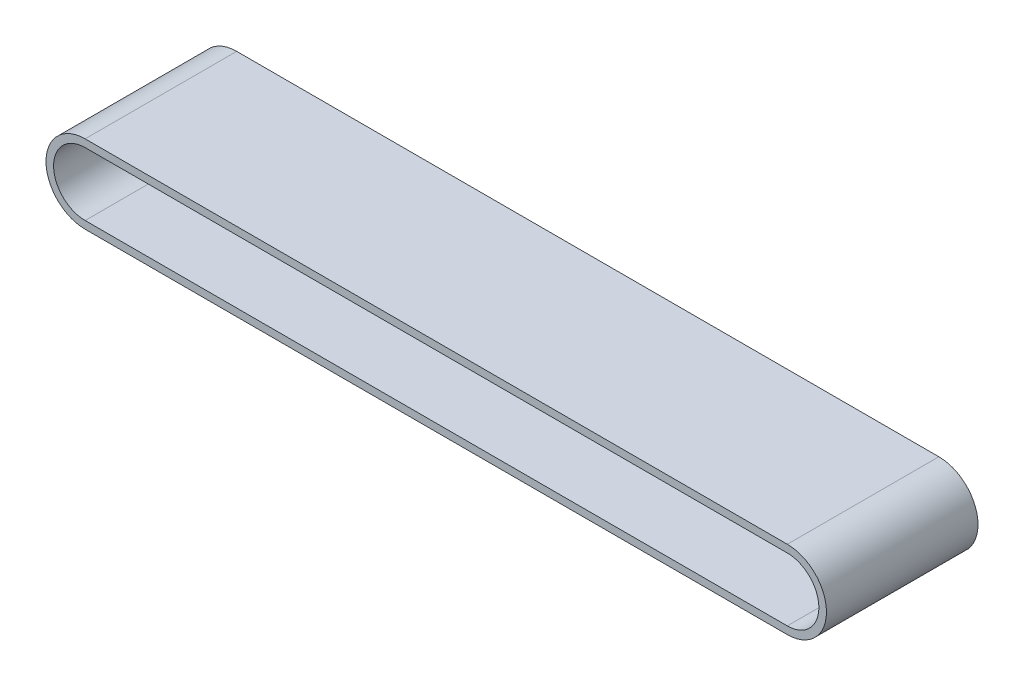
ISO-10303-21;
HEADER;
FILE_DESCRIPTION(('STEP AP214'),'2;1');
FILE_NAME('part.step','',(''),(''),'','','');
FILE_SCHEMA(('AUTOMOTIVE_DESIGN { 1 0 10303 214 1 1 1 1 }'));
ENDSEC;
DATA;
#1=APPLICATION_CONTEXT('core data for automotive mechanical design processes');
#2=APPLICATION_PROTOCOL_DEFINITION('international standard','automotive_design',2000,#1);
#3=PRODUCT_CONTEXT('',#1,'mechanical');
#4=PRODUCT('Part','Part','',(#3));
#5=PRODUCT_RELATED_PRODUCT_CATEGORY('part','',(#4));
#6=PRODUCT_DEFINITION_FORMATION('','',#4);
#7=PRODUCT_DEFINITION_CONTEXT('part definition',#1,'design');
#8=PRODUCT_DEFINITION('design','',#6,#7);
#9=PRODUCT_DEFINITION_SHAPE('','',#8);
#10=(LENGTH_UNIT() NAMED_UNIT(*) SI_UNIT(.MILLI.,.METRE.));
#11=(NAMED_UNIT(*) PLANE_ANGLE_UNIT() SI_UNIT($,.RADIAN.));
#12=(NAMED_UNIT(*) SI_UNIT($,.STERADIAN.) SOLID_ANGLE_UNIT());
#13=UNCERTAINTY_MEASURE_WITH_UNIT(LENGTH_MEASURE(1.E-05),#10,'distance_accuracy_value','');
#14=(GEOMETRIC_REPRESENTATION_CONTEXT(3) GLOBAL_UNCERTAINTY_ASSIGNED_CONTEXT((#13)) GLOBAL_UNIT_ASSIGNED_CONTEXT((#10,
#11,#12)) REPRESENTATION_CONTEXT('',''));
#15=CARTESIAN_POINT('',(0.,0.,0.));
#16=DIRECTION('',(0.,0.,1.));
#17=DIRECTION('',(1.,0.,0.));
#18=AXIS2_PLACEMENT_3D('',#15,#16,#17);
#19=CARTESIAN_POINT('',(-29.7120418848168,12.5,60.));
#20=DIRECTION('',(0.,0.,1.));
#21=DIRECTION('',(1.,0.,0.));
#22=AXIS2_PLACEMENT_3D('',#19,#20,#21);
#23=PLANE('',#22);
#24=CARTESIAN_POINT('',(-29.7120418848168,12.5,60.));
#25=DIRECTION('',(0.,0.,1.));
#26=DIRECTION('',(1.,0.,0.));
#27=AXIS2_PLACEMENT_3D('',#24,#25,#26);
#28=CIRCLE('',#27,15.5);
#29=CARTESIAN_POINT('',(-29.7120418848168,28.,60.));
#30=VERTEX_POINT('',#29);
#31=CARTESIAN_POINT('',(-29.7120418848168,-2.99999999999998,60.));
#32=VERTEX_POINT('',#31);
#33=EDGE_CURVE('E140',#30,#32,#28,.T.);
#34=ORIENTED_EDGE('',*,*,#33,.T.);
#35=DIRECTION('',(1.,0.,0.));
#36=VECTOR('',#35,1.);
#37=CARTESIAN_POINT('',(-29.7120418848168,-2.99999999999998,60.));
#38=LINE('',#37,#36);
#39=CARTESIAN_POINT('',(248.287958115183,-3.,60.));
#40=VERTEX_POINT('',#39);
#41=EDGE_CURVE('E143',#32,#40,#38,.T.);
#42=ORIENTED_EDGE('',*,*,#41,.T.);
#43=CARTESIAN_POINT('',(248.287958115183,12.5,60.));
#44=DIRECTION('',(0.,0.,1.));
#45=DIRECTION('',(1.,0.,0.));
#46=AXIS2_PLACEMENT_3D('',#43,#44,#45);
#47=CIRCLE('',#46,15.5);
#48=CARTESIAN_POINT('',(248.287958115183,28.,60.));
#49=VERTEX_POINT('',#48);
#50=EDGE_CURVE('E146',#40,#49,#47,.T.);
#51=ORIENTED_EDGE('',*,*,#50,.T.);
#52=DIRECTION('',(-1.,0.,0.));
#53=VECTOR('',#52,1.);
#54=CARTESIAN_POINT('',(-29.7120418848168,28.,60.));
#55=LINE('',#54,#53);
#56=EDGE_CURVE('E148',#49,#30,#55,.T.);
#57=ORIENTED_EDGE('',*,*,#56,.T.);
#58=EDGE_LOOP('',(#34,#42,#51,#57));
#59=FACE_BOUND('',#58,.T.);
#60=DIRECTION('',(1.,0.,0.));
#61=VECTOR('',#60,1.);
#62=CARTESIAN_POINT('',(-29.7120418848168,0.,60.));
#63=LINE('',#62,#61);
#64=CARTESIAN_POINT('',(-29.7120418848168,0.,60.));
#65=VERTEX_POINT('',#64);
#66=CARTESIAN_POINT('',(248.287958115183,0.,60.));
#67=VERTEX_POINT('',#66);
#68=EDGE_CURVE('E112',#65,#67,#63,.T.);
#69=ORIENTED_EDGE('',*,*,#68,.F.);
#70=CARTESIAN_POINT('',(-29.7120418848168,12.5,60.));
#71=DIRECTION('',(0.,0.,1.));
#72=DIRECTION('',(1.,0.,0.));
#73=AXIS2_PLACEMENT_3D('',#70,#71,#72);
#74=CIRCLE('',#73,12.5);
#75=CARTESIAN_POINT('',(-29.7120418848168,25.,60.));
#76=VERTEX_POINT('',#75);
#77=EDGE_CURVE('E104',#76,#65,#74,.T.);
#78=ORIENTED_EDGE('',*,*,#77,.F.);
#79=DIRECTION('',(-1.,0.,0.));
#80=VECTOR('',#79,1.);
#81=CARTESIAN_POINT('',(-29.7120418848168,25.,60.));
#82=LINE('',#81,#80);
#83=CARTESIAN_POINT('',(248.287958115183,25.,60.));
#84=VERTEX_POINT('',#83);
#85=EDGE_CURVE('E126',#84,#76,#82,.T.);
#86=ORIENTED_EDGE('',*,*,#85,.F.);
#87=CARTESIAN_POINT('',(248.287958115183,12.5,60.));
#88=DIRECTION('',(0.,0.,1.));
#89=DIRECTION('',(1.,0.,0.));
#90=AXIS2_PLACEMENT_3D('',#87,#88,#89);
#91=CIRCLE('',#90,12.5);
#92=EDGE_CURVE('E124',#67,#84,#91,.T.);
#93=ORIENTED_EDGE('',*,*,#92,.F.);
#94=EDGE_LOOP('',(#69,#78,#86,#93));
#95=FACE_BOUND('',#94,.T.);
#96=ADVANCED_FACE('F39',(#59,#95),#23,.T.);
#97=CARTESIAN_POINT('',(-29.7120418848168,12.5,0.));
#98=DIRECTION('',(0.,0.,1.));
#99=DIRECTION('',(1.,0.,0.));
#100=AXIS2_PLACEMENT_3D('',#97,#98,#99);
#101=PLANE('',#100);
#102=CARTESIAN_POINT('',(-29.7120418848168,12.5,0.));
#103=DIRECTION('',(0.,0.,1.));
#104=DIRECTION('',(1.,0.,0.));
#105=AXIS2_PLACEMENT_3D('',#102,#103,#104);
#106=CIRCLE('',#105,15.5);
#107=CARTESIAN_POINT('',(-29.7120418848168,28.,0.));
#108=VERTEX_POINT('',#107);
#109=CARTESIAN_POINT('',(-29.7120418848168,-2.99999999999998,0.));
#110=VERTEX_POINT('',#109);
#111=EDGE_CURVE('E120',#108,#110,#106,.T.);
#112=ORIENTED_EDGE('',*,*,#111,.F.);
#113=DIRECTION('',(-1.,0.,0.));
#114=VECTOR('',#113,1.);
#115=CARTESIAN_POINT('',(-29.7120418848168,28.,0.));
#116=LINE('',#115,#114);
#117=CARTESIAN_POINT('',(248.287958115183,28.,0.));
#118=VERTEX_POINT('',#117);
#119=EDGE_CURVE('E144',#118,#108,#116,.T.);
#120=ORIENTED_EDGE('',*,*,#119,.F.);
#121=CARTESIAN_POINT('',(248.287958115183,12.5,0.));
#122=DIRECTION('',(0.,0.,1.));
#123=DIRECTION('',(1.,0.,0.));
#124=AXIS2_PLACEMENT_3D('',#121,#122,#123);
#125=CIRCLE('',#124,15.5);
#126=CARTESIAN_POINT('',(248.287958115183,-3.,0.));
#127=VERTEX_POINT('',#126);
#128=EDGE_CURVE('E155',#127,#118,#125,.T.);
#129=ORIENTED_EDGE('',*,*,#128,.F.);
#130=DIRECTION('',(1.,0.,0.));
#131=VECTOR('',#130,1.);
#132=CARTESIAN_POINT('',(-29.7120418848168,-2.99999999999998,0.));
#133=LINE('',#132,#131);
#134=EDGE_CURVE('E153',#110,#127,#133,.T.);
#135=ORIENTED_EDGE('',*,*,#134,.F.);
#136=EDGE_LOOP('',(#112,#120,#129,#135));
#137=FACE_BOUND('',#136,.T.);
#138=CARTESIAN_POINT('',(-29.7120418848168,12.5,0.));
#139=DIRECTION('',(0.,0.,1.));
#140=DIRECTION('',(1.,0.,0.));
#141=AXIS2_PLACEMENT_3D('',#138,#139,#140);
#142=CIRCLE('',#141,12.5);
#143=CARTESIAN_POINT('',(-29.7120418848168,25.,0.));
#144=VERTEX_POINT('',#143);
#145=CARTESIAN_POINT('',(-29.7120418848168,0.,0.));
#146=VERTEX_POINT('',#145);
#147=EDGE_CURVE('E62',#144,#146,#142,.T.);
#148=ORIENTED_EDGE('',*,*,#147,.T.);
#149=DIRECTION('',(1.,0.,0.));
#150=VECTOR('',#149,1.);
#151=CARTESIAN_POINT('',(-29.7120418848168,0.,0.));
#152=LINE('',#151,#150);
#153=CARTESIAN_POINT('',(248.287958115183,0.,0.));
#154=VERTEX_POINT('',#153);
#155=EDGE_CURVE('E119',#146,#154,#152,.T.);
#156=ORIENTED_EDGE('',*,*,#155,.T.);
#157=CARTESIAN_POINT('',(248.287958115183,12.5,0.));
#158=DIRECTION('',(0.,0.,1.));
#159=DIRECTION('',(1.,0.,0.));
#160=AXIS2_PLACEMENT_3D('',#157,#158,#159);
#161=CIRCLE('',#160,12.5);
#162=CARTESIAN_POINT('',(248.287958115183,25.,0.));
#163=VERTEX_POINT('',#162);
#164=EDGE_CURVE('E132',#154,#163,#161,.T.);
#165=ORIENTED_EDGE('',*,*,#164,.T.);
#166=DIRECTION('',(-1.,0.,0.));
#167=VECTOR('',#166,1.);
#168=CARTESIAN_POINT('',(-29.7120418848168,25.,0.));
#169=LINE('',#168,#167);
#170=EDGE_CURVE('E113',#163,#144,#169,.T.);
#171=ORIENTED_EDGE('',*,*,#170,.T.);
#172=EDGE_LOOP('',(#148,#156,#165,#171));
#173=FACE_BOUND('',#172,.T.);
#174=ADVANCED_FACE('F173',(#137,#173),#101,.F.);
#175=CARTESIAN_POINT('',(-29.7120418848168,12.5,60.));
#176=DIRECTION('',(0.,0.,-1.));
#177=DIRECTION('',(-1.,0.,0.));
#178=AXIS2_PLACEMENT_3D('',#175,#176,#177);
#179=CYLINDRICAL_SURFACE('',#178,15.5);
#180=ORIENTED_EDGE('',*,*,#111,.T.);
#181=DIRECTION('',(0.,0.,-1.));
#182=VECTOR('',#181,1.);
#183=CARTESIAN_POINT('',(-29.7120418848168,-2.99999999999998,60.));
#184=LINE('',#183,#182);
#185=EDGE_CURVE('E11',#32,#110,#184,.T.);
#186=ORIENTED_EDGE('',*,*,#185,.F.);
#187=ORIENTED_EDGE('',*,*,#33,.F.);
#188=DIRECTION('',(0.,0.,-1.));
#189=VECTOR('',#188,1.);
#190=CARTESIAN_POINT('',(-29.7120418848168,28.,60.));
#191=LINE('',#190,#189);
#192=EDGE_CURVE('E150',#30,#108,#191,.T.);
#193=ORIENTED_EDGE('',*,*,#192,.T.);
#194=EDGE_LOOP('',(#180,#186,#187,#193));
#195=FACE_BOUND('',#194,.T.);
#196=ADVANCED_FACE('F41',(#195),#179,.T.);
#197=CARTESIAN_POINT('',(-29.7120418848168,-2.99999999999998,60.));
#198=DIRECTION('',(0.,1.,0.));
#199=DIRECTION('',(-1.,0.,0.));
#200=AXIS2_PLACEMENT_3D('',#197,#198,#199);
#201=PLANE('',#200);
#202=ORIENTED_EDGE('',*,*,#134,.T.);
#203=DIRECTION('',(0.,0.,-1.));
#204=VECTOR('',#203,1.);
#205=CARTESIAN_POINT('',(248.287958115183,-3.,60.));
#206=LINE('',#205,#204);
#207=EDGE_CURVE('E47',#40,#127,#206,.T.);
#208=ORIENTED_EDGE('',*,*,#207,.F.);
#209=ORIENTED_EDGE('',*,*,#41,.F.);
#210=ORIENTED_EDGE('',*,*,#185,.T.);
#211=EDGE_LOOP('',(#202,#208,#209,#210));
#212=FACE_BOUND('',#211,.T.);
#213=ADVANCED_FACE('F183',(#212),#201,.F.);
#214=CARTESIAN_POINT('',(248.287958115183,12.5,60.));
#215=DIRECTION('',(0.,0.,-1.));
#216=DIRECTION('',(-1.,0.,0.));
#217=AXIS2_PLACEMENT_3D('',#214,#215,#216);
#218=CYLINDRICAL_SURFACE('',#217,15.5);
#219=ORIENTED_EDGE('',*,*,#128,.T.);
#220=DIRECTION('',(0.,0.,-1.));
#221=VECTOR('',#220,1.);
#222=CARTESIAN_POINT('',(248.287958115183,28.,60.));
#223=LINE('',#222,#221);
#224=EDGE_CURVE('E160',#49,#118,#223,.T.);
#225=ORIENTED_EDGE('',*,*,#224,.F.);
#226=ORIENTED_EDGE('',*,*,#50,.F.);
#227=ORIENTED_EDGE('',*,*,#207,.T.);
#228=EDGE_LOOP('',(#219,#225,#226,#227));
#229=FACE_BOUND('',#228,.T.);
#230=ADVANCED_FACE('F167',(#229),#218,.T.);
#231=CARTESIAN_POINT('',(-29.7120418848168,28.,60.));
#232=DIRECTION('',(0.,-1.,0.));
#233=DIRECTION('',(0.,0.,-1.));
#234=AXIS2_PLACEMENT_3D('',#231,#232,#233);
#235=PLANE('',#234);
#236=ORIENTED_EDGE('',*,*,#119,.T.);
#237=ORIENTED_EDGE('',*,*,#192,.F.);
#238=ORIENTED_EDGE('',*,*,#56,.F.);
#239=ORIENTED_EDGE('',*,*,#224,.T.);
#240=EDGE_LOOP('',(#236,#237,#238,#239));
#241=FACE_BOUND('',#240,.T.);
#242=ADVANCED_FACE('F177',(#241),#235,.F.);
#243=CARTESIAN_POINT('',(-29.7120418848168,12.5,60.));
#244=DIRECTION('',(0.,0.,-1.));
#245=DIRECTION('',(-1.,0.,0.));
#246=AXIS2_PLACEMENT_3D('',#243,#244,#245);
#247=CYLINDRICAL_SURFACE('',#246,12.5);
#248=ORIENTED_EDGE('',*,*,#147,.F.);
#249=DIRECTION('',(0.,0.,-1.));
#250=VECTOR('',#249,1.);
#251=CARTESIAN_POINT('',(-29.7120418848168,25.,60.));
#252=LINE('',#251,#250);
#253=EDGE_CURVE('E108',#76,#144,#252,.T.);
#254=ORIENTED_EDGE('',*,*,#253,.F.);
#255=ORIENTED_EDGE('',*,*,#77,.T.);
#256=DIRECTION('',(0.,0.,-1.));
#257=VECTOR('',#256,1.);
#258=CARTESIAN_POINT('',(-29.7120418848168,0.,60.));
#259=LINE('',#258,#257);
#260=EDGE_CURVE('E107',#65,#146,#259,.T.);
#261=ORIENTED_EDGE('',*,*,#260,.T.);
#262=EDGE_LOOP('',(#248,#254,#255,#261));
#263=FACE_BOUND('',#262,.T.);
#264=ADVANCED_FACE('F106',(#263),#247,.F.);
#265=CARTESIAN_POINT('',(-29.7120418848168,0.,60.));
#266=DIRECTION('',(0.,1.,0.));
#267=DIRECTION('',(-1.,0.,0.));
#268=AXIS2_PLACEMENT_3D('',#265,#266,#267);
#269=PLANE('',#268);
#270=ORIENTED_EDGE('',*,*,#155,.F.);
#271=ORIENTED_EDGE('',*,*,#260,.F.);
#272=ORIENTED_EDGE('',*,*,#68,.T.);
#273=DIRECTION('',(0.,0.,-1.));
#274=VECTOR('',#273,1.);
#275=CARTESIAN_POINT('',(248.287958115183,0.,60.));
#276=LINE('',#275,#274);
#277=EDGE_CURVE('E121',#67,#154,#276,.T.);
#278=ORIENTED_EDGE('',*,*,#277,.T.);
#279=EDGE_LOOP('',(#270,#271,#272,#278));
#280=FACE_BOUND('',#279,.T.);
#281=ADVANCED_FACE('F116',(#280),#269,.T.);
#282=CARTESIAN_POINT('',(248.287958115183,12.5,60.));
#283=DIRECTION('',(0.,0.,-1.));
#284=DIRECTION('',(-1.,0.,0.));
#285=AXIS2_PLACEMENT_3D('',#282,#283,#284);
#286=CYLINDRICAL_SURFACE('',#285,12.5);
#287=ORIENTED_EDGE('',*,*,#164,.F.);
#288=ORIENTED_EDGE('',*,*,#277,.F.);
#289=ORIENTED_EDGE('',*,*,#92,.T.);
#290=DIRECTION('',(0.,0.,-1.));
#291=VECTOR('',#290,1.);
#292=CARTESIAN_POINT('',(248.287958115183,25.,60.));
#293=LINE('',#292,#291);
#294=EDGE_CURVE('E54',#84,#163,#293,.T.);
#295=ORIENTED_EDGE('',*,*,#294,.T.);
#296=EDGE_LOOP('',(#287,#288,#289,#295));
#297=FACE_BOUND('',#296,.T.);
#298=ADVANCED_FACE('F206',(#297),#286,.F.);
#299=CARTESIAN_POINT('',(-29.7120418848168,25.,60.));
#300=DIRECTION('',(0.,-1.,0.));
#301=DIRECTION('',(0.,0.,-1.));
#302=AXIS2_PLACEMENT_3D('',#299,#300,#301);
#303=PLANE('',#302);
#304=ORIENTED_EDGE('',*,*,#170,.F.);
#305=ORIENTED_EDGE('',*,*,#294,.F.);
#306=ORIENTED_EDGE('',*,*,#85,.T.);
#307=ORIENTED_EDGE('',*,*,#253,.T.);
#308=EDGE_LOOP('',(#304,#305,#306,#307));
#309=FACE_BOUND('',#308,.T.);
#310=ADVANCED_FACE('F210',(#309),#303,.T.);
#311=CLOSED_SHELL('',(#96,#174,#196,#213,#230,#242,#264,#281,#298,#310));
#312=MANIFOLD_SOLID_BREP('B2',#311);
#313=ADVANCED_BREP_SHAPE_REPRESENTATION('',(#18,#312),#14);
#314=SHAPE_DEFINITION_REPRESENTATION(#9,#313);
ENDSEC;
END-ISO-10303-21;
